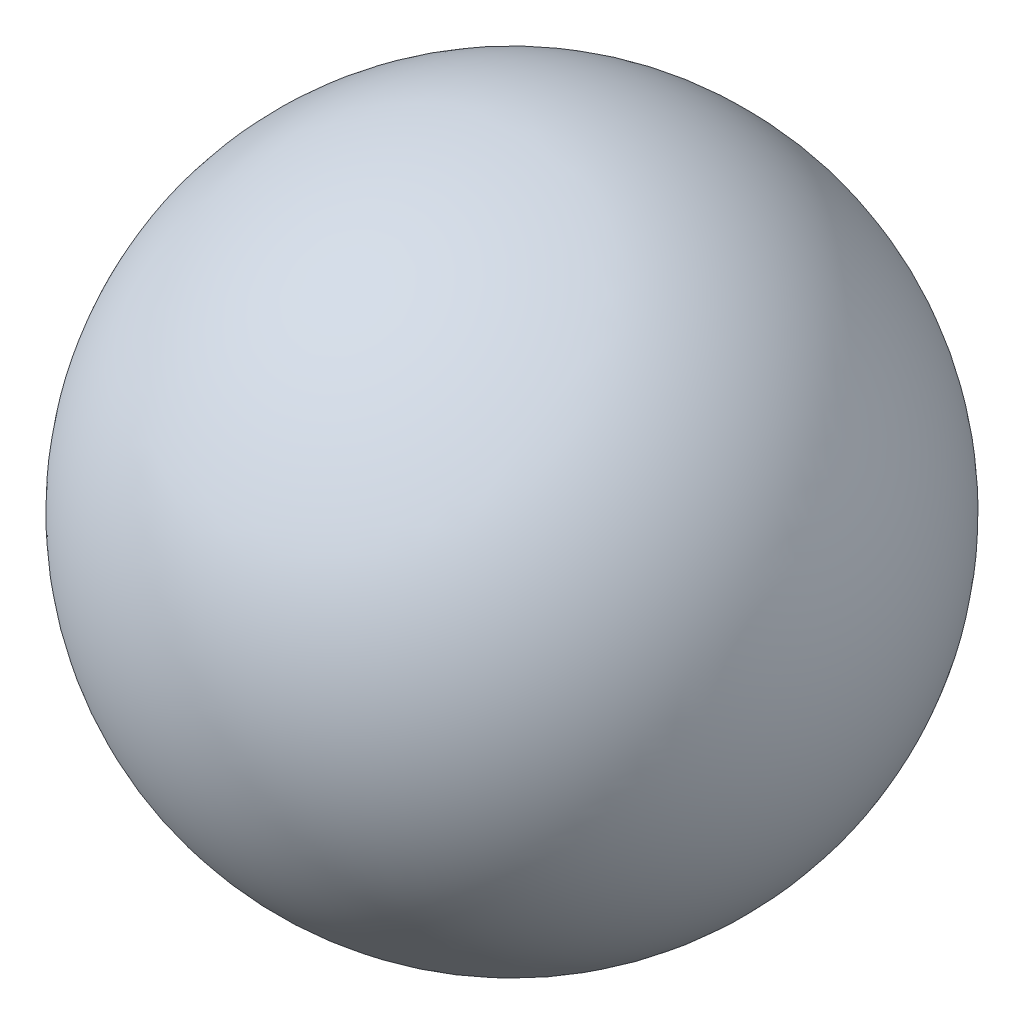
ISO-10303-21;
HEADER;
FILE_DESCRIPTION(('STEP AP214'),'2;1');
FILE_NAME('part.step','',(''),(''),'','','');
FILE_SCHEMA(('AUTOMOTIVE_DESIGN { 1 0 10303 214 1 1 1 1 }'));
ENDSEC;
DATA;
#1=APPLICATION_CONTEXT('core data for automotive mechanical design processes');
#2=APPLICATION_PROTOCOL_DEFINITION('international standard','automotive_design',2000,#1);
#3=PRODUCT_CONTEXT('',#1,'mechanical');
#4=PRODUCT('Part','Part','',(#3));
#5=PRODUCT_RELATED_PRODUCT_CATEGORY('part','',(#4));
#6=PRODUCT_DEFINITION_FORMATION('','',#4);
#7=PRODUCT_DEFINITION_CONTEXT('part definition',#1,'design');
#8=PRODUCT_DEFINITION('design','',#6,#7);
#9=PRODUCT_DEFINITION_SHAPE('','',#8);
#10=(LENGTH_UNIT() NAMED_UNIT(*) SI_UNIT(.MILLI.,.METRE.));
#11=(NAMED_UNIT(*) PLANE_ANGLE_UNIT() SI_UNIT($,.RADIAN.));
#12=(NAMED_UNIT(*) SI_UNIT($,.STERADIAN.) SOLID_ANGLE_UNIT());
#13=UNCERTAINTY_MEASURE_WITH_UNIT(LENGTH_MEASURE(1.E-05),#10,'distance_accuracy_value','');
#14=(GEOMETRIC_REPRESENTATION_CONTEXT(3) GLOBAL_UNCERTAINTY_ASSIGNED_CONTEXT((#13)) GLOBAL_UNIT_ASSIGNED_CONTEXT((#10,
#11,#12)) REPRESENTATION_CONTEXT('',''));
#15=CARTESIAN_POINT('',(0.,0.,0.));
#16=DIRECTION('',(0.,0.,1.));
#17=DIRECTION('',(1.,0.,0.));
#18=AXIS2_PLACEMENT_3D('',#15,#16,#17);
#19=CARTESIAN_POINT('',(6.5,53.75,0.));
#20=DIRECTION('',(-1.,0.,0.));
#21=DIRECTION('',(0.,1.,0.));
#22=AXIS2_PLACEMENT_3D('',#19,#20,#21);
#23=SPHERICAL_SURFACE('',#22,3.572);
#24=CARTESIAN_POINT('',(2.928,53.75,0.));
#25=VERTEX_POINT('',#24);
#26=VERTEX_LOOP('',#25);
#27=FACE_BOUND('',#26,.T.);
#28=ADVANCED_FACE('F29',(#27),#23,.T.);
#29=CLOSED_SHELL('',(#28));
#30=MANIFOLD_SOLID_BREP('B2',#29);
#31=ADVANCED_BREP_SHAPE_REPRESENTATION('',(#18,#30),#14);
#32=SHAPE_DEFINITION_REPRESENTATION(#9,#31);
ENDSEC;
END-ISO-10303-21;
